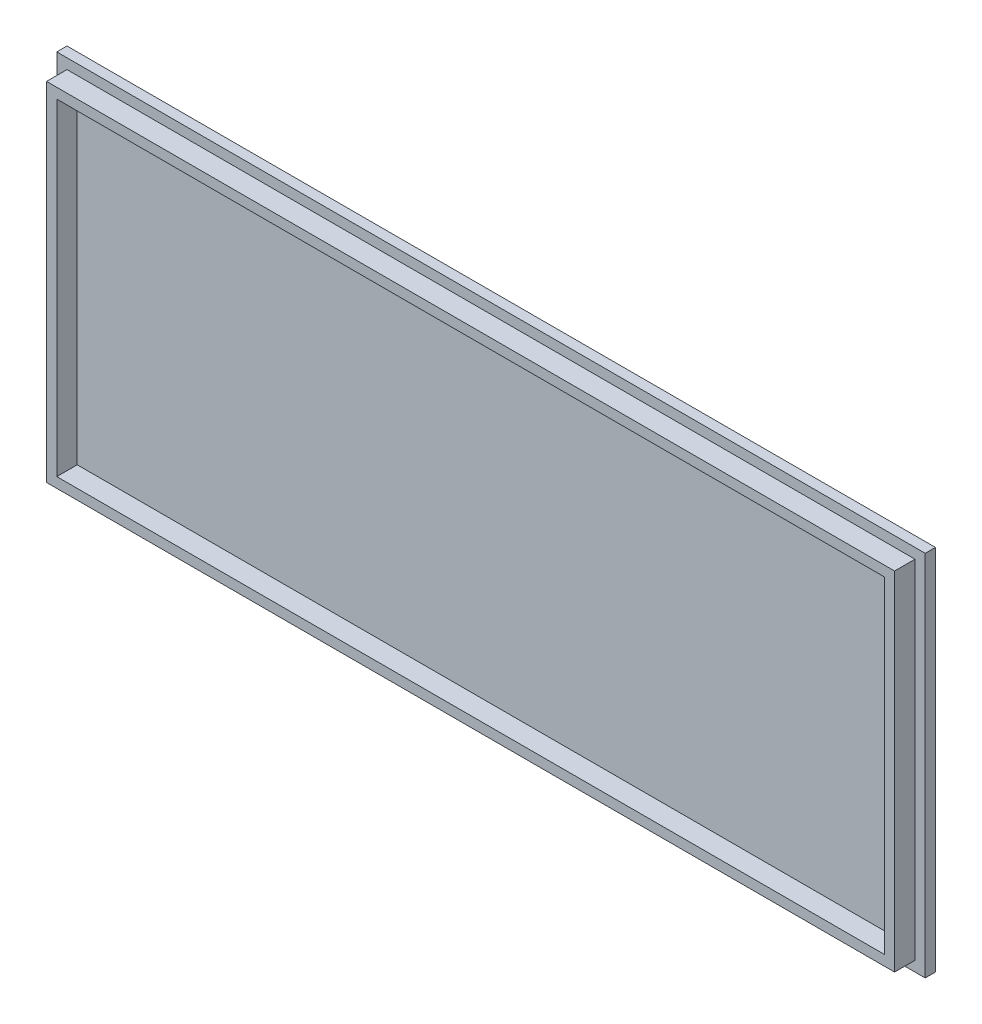
ISO-10303-21;
HEADER;
FILE_DESCRIPTION(('STEP AP214'),'2;1');
FILE_NAME('part.step','',(''),(''),'','','');
FILE_SCHEMA(('AUTOMOTIVE_DESIGN { 1 0 10303 214 1 1 1 1 }'));
ENDSEC;
DATA;
#1=APPLICATION_CONTEXT('core data for automotive mechanical design processes');
#2=APPLICATION_PROTOCOL_DEFINITION('international standard','automotive_design',2000,#1);
#3=PRODUCT_CONTEXT('',#1,'mechanical');
#4=PRODUCT('Part','Part','',(#3));
#5=PRODUCT_RELATED_PRODUCT_CATEGORY('part','',(#4));
#6=PRODUCT_DEFINITION_FORMATION('','',#4);
#7=PRODUCT_DEFINITION_CONTEXT('part definition',#1,'design');
#8=PRODUCT_DEFINITION('design','',#6,#7);
#9=PRODUCT_DEFINITION_SHAPE('','',#8);
#10=(LENGTH_UNIT() NAMED_UNIT(*) SI_UNIT(.MILLI.,.METRE.));
#11=(NAMED_UNIT(*) PLANE_ANGLE_UNIT() SI_UNIT($,.RADIAN.));
#12=(NAMED_UNIT(*) SI_UNIT($,.STERADIAN.) SOLID_ANGLE_UNIT());
#13=UNCERTAINTY_MEASURE_WITH_UNIT(LENGTH_MEASURE(1.E-05),#10,'distance_accuracy_value','');
#14=(GEOMETRIC_REPRESENTATION_CONTEXT(3) GLOBAL_UNCERTAINTY_ASSIGNED_CONTEXT((#13)) GLOBAL_UNIT_ASSIGNED_CONTEXT((#10,
#11,#12)) REPRESENTATION_CONTEXT('',''));
#15=CARTESIAN_POINT('',(0.,0.,0.));
#16=DIRECTION('',(0.,0.,1.));
#17=DIRECTION('',(1.,0.,0.));
#18=AXIS2_PLACEMENT_3D('',#15,#16,#17);
#19=CARTESIAN_POINT('',(0.,0.,1.));
#20=DIRECTION('',(0.,0.,1.));
#21=DIRECTION('',(1.,0.,0.));
#22=AXIS2_PLACEMENT_3D('',#19,#20,#21);
#23=PLANE('',#22);
#24=DIRECTION('',(0.,-1.,0.));
#25=VECTOR('',#24,1.);
#26=CARTESIAN_POINT('',(-85.,36.,1.));
#27=LINE('',#26,#25);
#28=CARTESIAN_POINT('',(-85.,36.,1.));
#29=VERTEX_POINT('',#28);
#30=CARTESIAN_POINT('',(-85.,0.,1.));
#31=VERTEX_POINT('',#30);
#32=EDGE_CURVE('E196',#29,#31,#27,.T.);
#33=ORIENTED_EDGE('',*,*,#32,.T.);
#34=DIRECTION('',(1.,0.,0.));
#35=VECTOR('',#34,1.);
#36=CARTESIAN_POINT('',(-85.,0.,1.));
#37=LINE('',#36,#35);
#38=CARTESIAN_POINT('',(0.,0.,1.));
#39=VERTEX_POINT('',#38);
#40=EDGE_CURVE('E199',#31,#39,#37,.T.);
#41=ORIENTED_EDGE('',*,*,#40,.T.);
#42=DIRECTION('',(0.,1.,0.));
#43=VECTOR('',#42,1.);
#44=CARTESIAN_POINT('',(0.,36.,1.));
#45=LINE('',#44,#43);
#46=CARTESIAN_POINT('',(0.,36.,1.));
#47=VERTEX_POINT('',#46);
#48=EDGE_CURVE('E202',#39,#47,#45,.T.);
#49=ORIENTED_EDGE('',*,*,#48,.T.);
#50=DIRECTION('',(-1.,0.,0.));
#51=VECTOR('',#50,1.);
#52=CARTESIAN_POINT('',(-85.,36.,1.));
#53=LINE('',#52,#51);
#54=EDGE_CURVE('E204',#47,#29,#53,.T.);
#55=ORIENTED_EDGE('',*,*,#54,.T.);
#56=EDGE_LOOP('',(#33,#41,#49,#55));
#57=FACE_BOUND('',#56,.T.);
#58=DIRECTION('',(0.,1.,0.));
#59=VECTOR('',#58,1.);
#60=CARTESIAN_POINT('',(-1.,1.,1.));
#61=LINE('',#60,#59);
#62=CARTESIAN_POINT('',(-1.,1.,1.));
#63=VERTEX_POINT('',#62);
#64=CARTESIAN_POINT('',(-1.,35.,1.));
#65=VERTEX_POINT('',#64);
#66=EDGE_CURVE('E182',#63,#65,#61,.T.);
#67=ORIENTED_EDGE('',*,*,#66,.F.);
#68=DIRECTION('',(1.,0.,0.));
#69=VECTOR('',#68,1.);
#70=CARTESIAN_POINT('',(-84.,1.,1.));
#71=LINE('',#70,#69);
#72=CARTESIAN_POINT('',(-84.,1.,1.));
#73=VERTEX_POINT('',#72);
#74=EDGE_CURVE('E147',#73,#63,#71,.T.);
#75=ORIENTED_EDGE('',*,*,#74,.F.);
#76=DIRECTION('',(0.,-1.,0.));
#77=VECTOR('',#76,1.);
#78=CARTESIAN_POINT('',(-84.,35.,1.));
#79=LINE('',#78,#77);
#80=CARTESIAN_POINT('',(-84.,35.,1.));
#81=VERTEX_POINT('',#80);
#82=EDGE_CURVE('E173',#81,#73,#79,.T.);
#83=ORIENTED_EDGE('',*,*,#82,.F.);
#84=DIRECTION('',(-1.,0.,0.));
#85=VECTOR('',#84,1.);
#86=CARTESIAN_POINT('',(-1.,35.,1.));
#87=LINE('',#86,#85);
#88=EDGE_CURVE('E184',#65,#81,#87,.T.);
#89=ORIENTED_EDGE('',*,*,#88,.F.);
#90=EDGE_LOOP('',(#67,#75,#83,#89));
#91=FACE_BOUND('',#90,.T.);
#92=ADVANCED_FACE('F39',(#57,#91),#23,.T.);
#93=CARTESIAN_POINT('',(-85.,36.,1.));
#94=DIRECTION('',(1.,0.,0.));
#95=DIRECTION('',(0.,0.,-1.));
#96=AXIS2_PLACEMENT_3D('',#93,#94,#95);
#97=PLANE('',#96);
#98=DIRECTION('',(0.,-1.,0.));
#99=VECTOR('',#98,1.);
#100=CARTESIAN_POINT('',(-85.,36.,0.));
#101=LINE('',#100,#99);
#102=CARTESIAN_POINT('',(-85.,36.,0.));
#103=VERTEX_POINT('',#102);
#104=CARTESIAN_POINT('',(-85.,0.,0.));
#105=VERTEX_POINT('',#104);
#106=EDGE_CURVE('E195',#103,#105,#101,.T.);
#107=ORIENTED_EDGE('',*,*,#106,.T.);
#108=DIRECTION('',(0.,0.,-1.));
#109=VECTOR('',#108,1.);
#110=CARTESIAN_POINT('',(-85.,0.,1.));
#111=LINE('',#110,#109);
#112=EDGE_CURVE('E11',#31,#105,#111,.T.);
#113=ORIENTED_EDGE('',*,*,#112,.F.);
#114=ORIENTED_EDGE('',*,*,#32,.F.);
#115=DIRECTION('',(0.,0.,-1.));
#116=VECTOR('',#115,1.);
#117=CARTESIAN_POINT('',(-85.,36.,1.));
#118=LINE('',#117,#116);
#119=EDGE_CURVE('E206',#29,#103,#118,.T.);
#120=ORIENTED_EDGE('',*,*,#119,.T.);
#121=EDGE_LOOP('',(#107,#113,#114,#120));
#122=FACE_BOUND('',#121,.T.);
#123=ADVANCED_FACE('F41',(#122),#97,.F.);
#124=CARTESIAN_POINT('',(-85.,0.,1.));
#125=DIRECTION('',(0.,1.,0.));
#126=DIRECTION('',(0.,0.,1.));
#127=AXIS2_PLACEMENT_3D('',#124,#125,#126);
#128=PLANE('',#127);
#129=DIRECTION('',(1.,0.,0.));
#130=VECTOR('',#129,1.);
#131=CARTESIAN_POINT('',(-85.,0.,0.));
#132=LINE('',#131,#130);
#133=CARTESIAN_POINT('',(0.,0.,0.));
#134=VERTEX_POINT('',#133);
#135=EDGE_CURVE('E209',#105,#134,#132,.T.);
#136=ORIENTED_EDGE('',*,*,#135,.T.);
#137=DIRECTION('',(0.,0.,-1.));
#138=VECTOR('',#137,1.);
#139=CARTESIAN_POINT('',(0.,0.,1.));
#140=LINE('',#139,#138);
#141=EDGE_CURVE('E47',#39,#134,#140,.T.);
#142=ORIENTED_EDGE('',*,*,#141,.F.);
#143=ORIENTED_EDGE('',*,*,#40,.F.);
#144=ORIENTED_EDGE('',*,*,#112,.T.);
#145=EDGE_LOOP('',(#136,#142,#143,#144));
#146=FACE_BOUND('',#145,.T.);
#147=ADVANCED_FACE('F239',(#146),#128,.F.);
#148=CARTESIAN_POINT('',(0.,36.,1.));
#149=DIRECTION('',(-1.,0.,0.));
#150=DIRECTION('',(0.,-1.,0.));
#151=AXIS2_PLACEMENT_3D('',#148,#149,#150);
#152=PLANE('',#151);
#153=DIRECTION('',(0.,1.,0.));
#154=VECTOR('',#153,1.);
#155=CARTESIAN_POINT('',(0.,36.,0.));
#156=LINE('',#155,#154);
#157=CARTESIAN_POINT('',(0.,36.,0.));
#158=VERTEX_POINT('',#157);
#159=EDGE_CURVE('E211',#134,#158,#156,.T.);
#160=ORIENTED_EDGE('',*,*,#159,.T.);
#161=DIRECTION('',(0.,0.,-1.));
#162=VECTOR('',#161,1.);
#163=CARTESIAN_POINT('',(0.,36.,1.));
#164=LINE('',#163,#162);
#165=EDGE_CURVE('E216',#47,#158,#164,.T.);
#166=ORIENTED_EDGE('',*,*,#165,.F.);
#167=ORIENTED_EDGE('',*,*,#48,.F.);
#168=ORIENTED_EDGE('',*,*,#141,.T.);
#169=EDGE_LOOP('',(#160,#166,#167,#168));
#170=FACE_BOUND('',#169,.T.);
#171=ADVANCED_FACE('F223',(#170),#152,.F.);
#172=CARTESIAN_POINT('',(-85.,36.,1.));
#173=DIRECTION('',(0.,-1.,0.));
#174=DIRECTION('',(0.,0.,-1.));
#175=AXIS2_PLACEMENT_3D('',#172,#173,#174);
#176=PLANE('',#175);
#177=DIRECTION('',(-1.,0.,0.));
#178=VECTOR('',#177,1.);
#179=CARTESIAN_POINT('',(-85.,36.,0.));
#180=LINE('',#179,#178);
#181=EDGE_CURVE('E200',#158,#103,#180,.T.);
#182=ORIENTED_EDGE('',*,*,#181,.T.);
#183=ORIENTED_EDGE('',*,*,#119,.F.);
#184=ORIENTED_EDGE('',*,*,#54,.F.);
#185=ORIENTED_EDGE('',*,*,#165,.T.);
#186=EDGE_LOOP('',(#182,#183,#184,#185));
#187=FACE_BOUND('',#186,.T.);
#188=ADVANCED_FACE('F232',(#187),#176,.F.);
#189=CARTESIAN_POINT('',(0.,0.,0.));
#190=DIRECTION('',(0.,0.,1.));
#191=DIRECTION('',(1.,0.,0.));
#192=AXIS2_PLACEMENT_3D('',#189,#190,#191);
#193=PLANE('',#192);
#194=ORIENTED_EDGE('',*,*,#106,.F.);
#195=ORIENTED_EDGE('',*,*,#181,.F.);
#196=ORIENTED_EDGE('',*,*,#159,.F.);
#197=ORIENTED_EDGE('',*,*,#135,.F.);
#198=EDGE_LOOP('',(#194,#195,#196,#197));
#199=FACE_BOUND('',#198,.T.);
#200=ADVANCED_FACE('F229',(#199),#193,.F.);
#201=CARTESIAN_POINT('',(0.,0.,3.));
#202=DIRECTION('',(0.,0.,1.));
#203=DIRECTION('',(1.,0.,0.));
#204=AXIS2_PLACEMENT_3D('',#201,#202,#203);
#205=PLANE('',#204);
#206=DIRECTION('',(1.,0.,0.));
#207=VECTOR('',#206,1.);
#208=CARTESIAN_POINT('',(-84.,1.,3.));
#209=LINE('',#208,#207);
#210=CARTESIAN_POINT('',(-84.,1.,3.));
#211=VERTEX_POINT('',#210);
#212=CARTESIAN_POINT('',(-1.,1.,3.));
#213=VERTEX_POINT('',#212);
#214=EDGE_CURVE('E169',#211,#213,#209,.T.);
#215=ORIENTED_EDGE('',*,*,#214,.T.);
#216=DIRECTION('',(0.,1.,0.));
#217=VECTOR('',#216,1.);
#218=CARTESIAN_POINT('',(-1.,1.,3.));
#219=LINE('',#218,#217);
#220=CARTESIAN_POINT('',(-1.,35.,3.));
#221=VERTEX_POINT('',#220);
#222=EDGE_CURVE('E172',#213,#221,#219,.T.);
#223=ORIENTED_EDGE('',*,*,#222,.T.);
#224=DIRECTION('',(-1.,0.,0.));
#225=VECTOR('',#224,1.);
#226=CARTESIAN_POINT('',(-1.,35.,3.));
#227=LINE('',#226,#225);
#228=CARTESIAN_POINT('',(-84.,35.,3.));
#229=VERTEX_POINT('',#228);
#230=EDGE_CURVE('E175',#221,#229,#227,.T.);
#231=ORIENTED_EDGE('',*,*,#230,.T.);
#232=DIRECTION('',(0.,-1.,0.));
#233=VECTOR('',#232,1.);
#234=CARTESIAN_POINT('',(-84.,35.,3.));
#235=LINE('',#234,#233);
#236=EDGE_CURVE('E177',#229,#211,#235,.T.);
#237=ORIENTED_EDGE('',*,*,#236,.T.);
#238=EDGE_LOOP('',(#215,#223,#231,#237));
#239=FACE_BOUND('',#238,.T.);
#240=DIRECTION('',(0.,1.,0.));
#241=VECTOR('',#240,1.);
#242=CARTESIAN_POINT('',(-2.,2.,3.));
#243=LINE('',#242,#241);
#244=CARTESIAN_POINT('',(-2.,2.,3.));
#245=VERTEX_POINT('',#244);
#246=CARTESIAN_POINT('',(-2.,34.,3.));
#247=VERTEX_POINT('',#246);
#248=EDGE_CURVE('E139',#245,#247,#243,.T.);
#249=ORIENTED_EDGE('',*,*,#248,.F.);
#250=DIRECTION('',(1.,0.,0.));
#251=VECTOR('',#250,1.);
#252=CARTESIAN_POINT('',(-83.,1.99999999999999,3.));
#253=LINE('',#252,#251);
#254=CARTESIAN_POINT('',(-83.,1.99999999999999,3.));
#255=VERTEX_POINT('',#254);
#256=EDGE_CURVE('E130',#255,#245,#253,.T.);
#257=ORIENTED_EDGE('',*,*,#256,.F.);
#258=DIRECTION('',(0.,-1.,0.));
#259=VECTOR('',#258,1.);
#260=CARTESIAN_POINT('',(-83.,34.,3.));
#261=LINE('',#260,#259);
#262=CARTESIAN_POINT('',(-83.,34.,3.));
#263=VERTEX_POINT('',#262);
#264=EDGE_CURVE('E155',#263,#255,#261,.T.);
#265=ORIENTED_EDGE('',*,*,#264,.F.);
#266=DIRECTION('',(-1.,0.,0.));
#267=VECTOR('',#266,1.);
#268=CARTESIAN_POINT('',(-2.,34.,3.));
#269=LINE('',#268,#267);
#270=EDGE_CURVE('E153',#247,#263,#269,.T.);
#271=ORIENTED_EDGE('',*,*,#270,.F.);
#272=EDGE_LOOP('',(#249,#257,#265,#271));
#273=FACE_BOUND('',#272,.T.);
#274=ADVANCED_FACE('F151',(#239,#273),#205,.T.);
#275=CARTESIAN_POINT('',(-84.,1.,3.));
#276=DIRECTION('',(0.,1.,0.));
#277=DIRECTION('',(0.,0.,1.));
#278=AXIS2_PLACEMENT_3D('',#275,#276,#277);
#279=PLANE('',#278);
#280=ORIENTED_EDGE('',*,*,#74,.T.);
#281=DIRECTION('',(0.,0.,-1.));
#282=VECTOR('',#281,1.);
#283=CARTESIAN_POINT('',(-1.,1.,3.));
#284=LINE('',#283,#282);
#285=EDGE_CURVE('E193',#213,#63,#284,.T.);
#286=ORIENTED_EDGE('',*,*,#285,.F.);
#287=ORIENTED_EDGE('',*,*,#214,.F.);
#288=DIRECTION('',(0.,0.,-1.));
#289=VECTOR('',#288,1.);
#290=CARTESIAN_POINT('',(-84.,1.,3.));
#291=LINE('',#290,#289);
#292=EDGE_CURVE('E179',#211,#73,#291,.T.);
#293=ORIENTED_EDGE('',*,*,#292,.T.);
#294=EDGE_LOOP('',(#280,#286,#287,#293));
#295=FACE_BOUND('',#294,.T.);
#296=ADVANCED_FACE('F276',(#295),#279,.F.);
#297=CARTESIAN_POINT('',(-1.,1.,3.));
#298=DIRECTION('',(-1.,0.,0.));
#299=DIRECTION('',(0.,-1.,0.));
#300=AXIS2_PLACEMENT_3D('',#297,#298,#299);
#301=PLANE('',#300);
#302=ORIENTED_EDGE('',*,*,#66,.T.);
#303=DIRECTION('',(0.,0.,-1.));
#304=VECTOR('',#303,1.);
#305=CARTESIAN_POINT('',(-1.,35.,3.));
#306=LINE('',#305,#304);
#307=EDGE_CURVE('E190',#221,#65,#306,.T.);
#308=ORIENTED_EDGE('',*,*,#307,.F.);
#309=ORIENTED_EDGE('',*,*,#222,.F.);
#310=ORIENTED_EDGE('',*,*,#285,.T.);
#311=EDGE_LOOP('',(#302,#308,#309,#310));
#312=FACE_BOUND('',#311,.T.);
#313=ADVANCED_FACE('F283',(#312),#301,.F.);
#314=CARTESIAN_POINT('',(-1.,35.,3.));
#315=DIRECTION('',(0.,-1.,0.));
#316=DIRECTION('',(0.,0.,-1.));
#317=AXIS2_PLACEMENT_3D('',#314,#315,#316);
#318=PLANE('',#317);
#319=ORIENTED_EDGE('',*,*,#88,.T.);
#320=DIRECTION('',(0.,0.,-1.));
#321=VECTOR('',#320,1.);
#322=CARTESIAN_POINT('',(-84.,35.,3.));
#323=LINE('',#322,#321);
#324=EDGE_CURVE('E54',#229,#81,#323,.T.);
#325=ORIENTED_EDGE('',*,*,#324,.F.);
#326=ORIENTED_EDGE('',*,*,#230,.F.);
#327=ORIENTED_EDGE('',*,*,#307,.T.);
#328=EDGE_LOOP('',(#319,#325,#326,#327));
#329=FACE_BOUND('',#328,.T.);
#330=ADVANCED_FACE('F280',(#329),#318,.F.);
#331=CARTESIAN_POINT('',(-84.,35.,3.));
#332=DIRECTION('',(1.,0.,0.));
#333=DIRECTION('',(0.,0.,-1.));
#334=AXIS2_PLACEMENT_3D('',#331,#332,#333);
#335=PLANE('',#334);
#336=ORIENTED_EDGE('',*,*,#82,.T.);
#337=ORIENTED_EDGE('',*,*,#292,.F.);
#338=ORIENTED_EDGE('',*,*,#236,.F.);
#339=ORIENTED_EDGE('',*,*,#324,.T.);
#340=EDGE_LOOP('',(#336,#337,#338,#339));
#341=FACE_BOUND('',#340,.T.);
#342=ADVANCED_FACE('F274',(#341),#335,.F.);
#343=CARTESIAN_POINT('',(-83.,1.99999999999999,3.));
#344=DIRECTION('',(0.,1.,0.));
#345=DIRECTION('',(-1.,0.,0.));
#346=AXIS2_PLACEMENT_3D('',#343,#344,#345);
#347=PLANE('',#346);
#348=DIRECTION('',(1.,0.,0.));
#349=VECTOR('',#348,1.);
#350=CARTESIAN_POINT('',(-83.,1.99999999999999,1.));
#351=LINE('',#350,#349);
#352=CARTESIAN_POINT('',(-83.,1.99999999999999,1.));
#353=VERTEX_POINT('',#352);
#354=CARTESIAN_POINT('',(-2.,2.,1.));
#355=VERTEX_POINT('',#354);
#356=EDGE_CURVE('E62',#353,#355,#351,.T.);
#357=ORIENTED_EDGE('',*,*,#356,.F.);
#358=DIRECTION('',(0.,0.,-1.));
#359=VECTOR('',#358,1.);
#360=CARTESIAN_POINT('',(-83.,1.99999999999999,3.));
#361=LINE('',#360,#359);
#362=EDGE_CURVE('E135',#255,#353,#361,.T.);
#363=ORIENTED_EDGE('',*,*,#362,.F.);
#364=ORIENTED_EDGE('',*,*,#256,.T.);
#365=DIRECTION('',(0.,0.,-1.));
#366=VECTOR('',#365,1.);
#367=CARTESIAN_POINT('',(-2.,2.,3.));
#368=LINE('',#367,#366);
#369=EDGE_CURVE('E133',#245,#355,#368,.T.);
#370=ORIENTED_EDGE('',*,*,#369,.T.);
#371=EDGE_LOOP('',(#357,#363,#364,#370));
#372=FACE_BOUND('',#371,.T.);
#373=ADVANCED_FACE('F132',(#372),#347,.T.);
#374=CARTESIAN_POINT('',(-2.,2.,3.));
#375=DIRECTION('',(-1.,0.,0.));
#376=DIRECTION('',(0.,0.,1.));
#377=AXIS2_PLACEMENT_3D('',#374,#375,#376);
#378=PLANE('',#377);
#379=DIRECTION('',(0.,1.,0.));
#380=VECTOR('',#379,1.);
#381=CARTESIAN_POINT('',(-2.,2.,1.));
#382=LINE('',#381,#380);
#383=CARTESIAN_POINT('',(-2.,34.,1.));
#384=VERTEX_POINT('',#383);
#385=EDGE_CURVE('E146',#355,#384,#382,.T.);
#386=ORIENTED_EDGE('',*,*,#385,.F.);
#387=ORIENTED_EDGE('',*,*,#369,.F.);
#388=ORIENTED_EDGE('',*,*,#248,.T.);
#389=DIRECTION('',(0.,0.,-1.));
#390=VECTOR('',#389,1.);
#391=CARTESIAN_POINT('',(-2.,34.,3.));
#392=LINE('',#391,#390);
#393=EDGE_CURVE('E148',#247,#384,#392,.T.);
#394=ORIENTED_EDGE('',*,*,#393,.T.);
#395=EDGE_LOOP('',(#386,#387,#388,#394));
#396=FACE_BOUND('',#395,.T.);
#397=ADVANCED_FACE('F143',(#396),#378,.T.);
#398=CARTESIAN_POINT('',(-2.,34.,3.));
#399=DIRECTION('',(0.,-1.,0.));
#400=DIRECTION('',(1.,0.,0.));
#401=AXIS2_PLACEMENT_3D('',#398,#399,#400);
#402=PLANE('',#401);
#403=DIRECTION('',(-1.,0.,0.));
#404=VECTOR('',#403,1.);
#405=CARTESIAN_POINT('',(-2.,34.,1.));
#406=LINE('',#405,#404);
#407=CARTESIAN_POINT('',(-83.,34.,1.));
#408=VERTEX_POINT('',#407);
#409=EDGE_CURVE('E161',#384,#408,#406,.T.);
#410=ORIENTED_EDGE('',*,*,#409,.F.);
#411=ORIENTED_EDGE('',*,*,#393,.F.);
#412=ORIENTED_EDGE('',*,*,#270,.T.);
#413=DIRECTION('',(0.,0.,-1.));
#414=VECTOR('',#413,1.);
#415=CARTESIAN_POINT('',(-83.,34.,3.));
#416=LINE('',#415,#414);
#417=EDGE_CURVE('E165',#263,#408,#416,.T.);
#418=ORIENTED_EDGE('',*,*,#417,.T.);
#419=EDGE_LOOP('',(#410,#411,#412,#418));
#420=FACE_BOUND('',#419,.T.);
#421=ADVANCED_FACE('F260',(#420),#402,.T.);
#422=CARTESIAN_POINT('',(-83.,34.,3.));
#423=DIRECTION('',(1.,0.,0.));
#424=DIRECTION('',(0.,0.,-1.));
#425=AXIS2_PLACEMENT_3D('',#422,#423,#424);
#426=PLANE('',#425);
#427=DIRECTION('',(0.,-1.,0.));
#428=VECTOR('',#427,1.);
#429=CARTESIAN_POINT('',(-83.,34.,1.));
#430=LINE('',#429,#428);
#431=EDGE_CURVE('E140',#408,#353,#430,.T.);
#432=ORIENTED_EDGE('',*,*,#431,.F.);
#433=ORIENTED_EDGE('',*,*,#417,.F.);
#434=ORIENTED_EDGE('',*,*,#264,.T.);
#435=ORIENTED_EDGE('',*,*,#362,.T.);
#436=EDGE_LOOP('',(#432,#433,#434,#435));
#437=FACE_BOUND('',#436,.T.);
#438=ADVANCED_FACE('F256',(#437),#426,.T.);
#439=ORIENTED_EDGE('',*,*,#356,.T.);
#440=ORIENTED_EDGE('',*,*,#385,.T.);
#441=ORIENTED_EDGE('',*,*,#409,.T.);
#442=ORIENTED_EDGE('',*,*,#431,.T.);
#443=EDGE_LOOP('',(#439,#440,#441,#442));
#444=FACE_BOUND('',#443,.T.);
#445=ADVANCED_FACE('F248',(#444),#23,.T.);
#446=CLOSED_SHELL('',(#92,#123,#147,#171,#188,#200,#274,#296,#313,#330,#342,#373,#397,#421,#438,#445));
#447=MANIFOLD_SOLID_BREP('B2',#446);
#448=ADVANCED_BREP_SHAPE_REPRESENTATION('',(#18,#447),#14);
#449=SHAPE_DEFINITION_REPRESENTATION(#9,#448);
ENDSEC;
END-ISO-10303-21;
